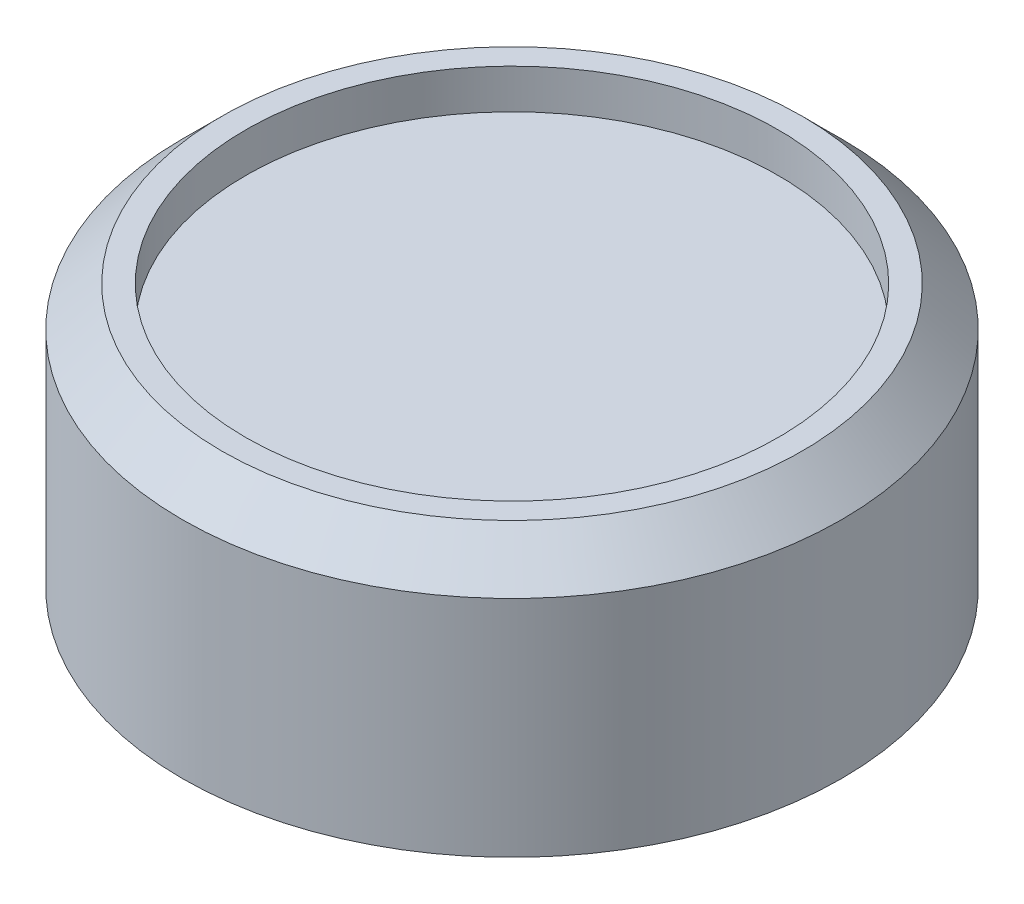
ISO-10303-21;
HEADER;
FILE_DESCRIPTION(('STEP AP214'),'2;1');
FILE_NAME('part.step','',(''),(''),'','','');
FILE_SCHEMA(('AUTOMOTIVE_DESIGN { 1 0 10303 214 1 1 1 1 }'));
ENDSEC;
DATA;
#1=APPLICATION_CONTEXT('core data for automotive mechanical design processes');
#2=APPLICATION_PROTOCOL_DEFINITION('international standard','automotive_design',2000,#1);
#3=PRODUCT_CONTEXT('',#1,'mechanical');
#4=PRODUCT('Part','Part','',(#3));
#5=PRODUCT_RELATED_PRODUCT_CATEGORY('part','',(#4));
#6=PRODUCT_DEFINITION_FORMATION('','',#4);
#7=PRODUCT_DEFINITION_CONTEXT('part definition',#1,'design');
#8=PRODUCT_DEFINITION('design','',#6,#7);
#9=PRODUCT_DEFINITION_SHAPE('','',#8);
#10=(LENGTH_UNIT() NAMED_UNIT(*) SI_UNIT(.MILLI.,.METRE.));
#11=(NAMED_UNIT(*) PLANE_ANGLE_UNIT() SI_UNIT($,.RADIAN.));
#12=(NAMED_UNIT(*) SI_UNIT($,.STERADIAN.) SOLID_ANGLE_UNIT());
#13=UNCERTAINTY_MEASURE_WITH_UNIT(LENGTH_MEASURE(1.E-05),#10,'distance_accuracy_value','');
#14=(GEOMETRIC_REPRESENTATION_CONTEXT(3) GLOBAL_UNCERTAINTY_ASSIGNED_CONTEXT((#13)) GLOBAL_UNIT_ASSIGNED_CONTEXT((#10,
#11,#12)) REPRESENTATION_CONTEXT('',''));
#15=CARTESIAN_POINT('',(0.,0.,0.));
#16=DIRECTION('',(0.,0.,1.));
#17=DIRECTION('',(1.,0.,0.));
#18=AXIS2_PLACEMENT_3D('',#15,#16,#17);
#19=CARTESIAN_POINT('',(0.,10.,0.));
#20=DIRECTION('',(0.,-1.,0.));
#21=DIRECTION('',(0.,0.,-1.));
#22=AXIS2_PLACEMENT_3D('',#19,#20,#21);
#23=CYLINDRICAL_SURFACE('',#22,12.5);
#24=CARTESIAN_POINT('',(0.,8.49999999999999,0.));
#25=DIRECTION('',(0.,1.,0.));
#26=DIRECTION('',(0.,0.,1.));
#27=AXIS2_PLACEMENT_3D('',#24,#25,#26);
#28=CIRCLE('',#27,12.5);
#29=CARTESIAN_POINT('',(0.,8.49999999999999,12.5));
#30=VERTEX_POINT('',#29);
#31=EDGE_CURVE('E43',#30,#30,#28,.F.);
#32=ORIENTED_EDGE('',*,*,#31,.T.);
#33=EDGE_LOOP('',(#32));
#34=FACE_BOUND('',#33,.T.);
#35=CARTESIAN_POINT('',(0.,0.,0.));
#36=DIRECTION('',(0.,1.,0.));
#37=DIRECTION('',(0.,0.,1.));
#38=AXIS2_PLACEMENT_3D('',#35,#36,#37);
#39=CIRCLE('',#38,12.5);
#40=CARTESIAN_POINT('',(0.,0.,12.5));
#41=VERTEX_POINT('',#40);
#42=EDGE_CURVE('E112',#41,#41,#39,.T.);
#43=ORIENTED_EDGE('',*,*,#42,.T.);
#44=EDGE_LOOP('',(#43));
#45=FACE_BOUND('',#44,.T.);
#46=ADVANCED_FACE('F34',(#34,#45),#23,.T.);
#47=CARTESIAN_POINT('',(0.,10.,0.));
#48=DIRECTION('',(0.,1.,0.));
#49=DIRECTION('',(0.,0.,1.));
#50=AXIS2_PLACEMENT_3D('',#47,#48,#49);
#51=PLANE('',#50);
#52=CARTESIAN_POINT('',(0.,10.,0.));
#53=DIRECTION('',(0.,1.,0.));
#54=DIRECTION('',(0.,0.,1.));
#55=AXIS2_PLACEMENT_3D('',#52,#53,#54);
#56=CIRCLE('',#55,10.1);
#57=CARTESIAN_POINT('',(0.,10.,10.1));
#58=VERTEX_POINT('',#57);
#59=EDGE_CURVE('E183',#58,#58,#56,.T.);
#60=ORIENTED_EDGE('',*,*,#59,.F.);
#61=EDGE_LOOP('',(#60));
#62=FACE_BOUND('',#61,.T.);
#63=CARTESIAN_POINT('',(0.,10.,0.));
#64=DIRECTION('',(0.,1.,0.));
#65=DIRECTION('',(0.,0.,1.));
#66=AXIS2_PLACEMENT_3D('',#63,#64,#65);
#67=CIRCLE('',#66,11.);
#68=CARTESIAN_POINT('',(0.,10.,11.));
#69=VERTEX_POINT('',#68);
#70=EDGE_CURVE('E115',#69,#69,#67,.T.);
#71=ORIENTED_EDGE('',*,*,#70,.T.);
#72=EDGE_LOOP('',(#71));
#73=FACE_BOUND('',#72,.T.);
#74=ADVANCED_FACE('F129',(#62,#73),#51,.T.);
#75=CARTESIAN_POINT('',(0.,0.,0.));
#76=DIRECTION('',(0.,1.,0.));
#77=DIRECTION('',(0.,0.,1.));
#78=AXIS2_PLACEMENT_3D('',#75,#76,#77);
#79=PLANE('',#78);
#80=CARTESIAN_POINT('',(0.,0.,0.));
#81=DIRECTION('',(0.,1.,0.));
#82=DIRECTION('',(0.,0.,1.));
#83=AXIS2_PLACEMENT_3D('',#80,#81,#82);
#84=CIRCLE('',#83,10.);
#85=CARTESIAN_POINT('',(0.,0.,10.));
#86=VERTEX_POINT('',#85);
#87=EDGE_CURVE('E38',#86,#86,#84,.F.);
#88=ORIENTED_EDGE('',*,*,#87,.F.);
#89=EDGE_LOOP('',(#88));
#90=FACE_BOUND('',#89,.T.);
#91=ORIENTED_EDGE('',*,*,#42,.F.);
#92=EDGE_LOOP('',(#91));
#93=FACE_BOUND('',#92,.T.);
#94=ADVANCED_FACE('F126',(#90,#93),#79,.F.);
#95=CARTESIAN_POINT('',(0.,10.,0.));
#96=DIRECTION('',(0.,-1.,0.));
#97=DIRECTION('',(0.,0.,-1.));
#98=AXIS2_PLACEMENT_3D('',#95,#96,#97);
#99=CONICAL_SURFACE('',#98,11.,0.785398163397445);
#100=ORIENTED_EDGE('',*,*,#31,.F.);
#101=EDGE_LOOP('',(#100));
#102=FACE_BOUND('',#101,.T.);
#103=ORIENTED_EDGE('',*,*,#70,.F.);
#104=EDGE_LOOP('',(#103));
#105=FACE_BOUND('',#104,.T.);
#106=ADVANCED_FACE('F36',(#102,#105),#99,.T.);
#107=CARTESIAN_POINT('',(0.,-3.7,0.));
#108=DIRECTION('',(0.,1.,0.));
#109=DIRECTION('',(0.,0.,1.));
#110=AXIS2_PLACEMENT_3D('',#107,#108,#109);
#111=CYLINDRICAL_SURFACE('',#110,10.);
#112=CARTESIAN_POINT('',(0.,2.3,0.));
#113=DIRECTION('',(0.,-1.,0.));
#114=DIRECTION('',(0.,0.,-1.));
#115=AXIS2_PLACEMENT_3D('',#112,#113,#114);
#116=CIRCLE('',#115,10.);
#117=CARTESIAN_POINT('',(0.,2.3,-10.));
#118=VERTEX_POINT('',#117);
#119=EDGE_CURVE('E182',#118,#118,#116,.T.);
#120=ORIENTED_EDGE('',*,*,#119,.F.);
#121=EDGE_LOOP('',(#120));
#122=FACE_BOUND('',#121,.T.);
#123=ORIENTED_EDGE('',*,*,#87,.T.);
#124=EDGE_LOOP('',(#123));
#125=FACE_BOUND('',#124,.T.);
#126=ADVANCED_FACE('F125',(#122,#125),#111,.F.);
#127=CARTESIAN_POINT('',(0.,2.3,0.));
#128=DIRECTION('',(0.,-1.,0.));
#129=DIRECTION('',(0.,0.,-1.));
#130=AXIS2_PLACEMENT_3D('',#127,#128,#129);
#131=PLANE('',#130);
#132=ORIENTED_EDGE('',*,*,#119,.T.);
#133=EDGE_LOOP('',(#132));
#134=FACE_BOUND('',#133,.T.);
#135=DIRECTION('',(-0.5,0.,-0.866025403784439));
#136=VECTOR('',#135,1.);
#137=CARTESIAN_POINT('',(3.8682468035705,2.3,-6.7));
#138=LINE('',#137,#136);
#139=CARTESIAN_POINT('',(7.73649360714099,2.3,0.));
#140=VERTEX_POINT('',#139);
#141=CARTESIAN_POINT('',(3.8682468035705,2.3,-6.7));
#142=VERTEX_POINT('',#141);
#143=EDGE_CURVE('E88',#140,#142,#138,.T.);
#144=ORIENTED_EDGE('',*,*,#143,.T.);
#145=DIRECTION('',(-1.,0.,0.));
#146=VECTOR('',#145,1.);
#147=CARTESIAN_POINT('',(-3.86824680357049,2.3,-6.7));
#148=LINE('',#147,#146);
#149=CARTESIAN_POINT('',(-3.86824680357049,2.3,-6.7));
#150=VERTEX_POINT('',#149);
#151=EDGE_CURVE('E96',#142,#150,#148,.T.);
#152=ORIENTED_EDGE('',*,*,#151,.T.);
#153=DIRECTION('',(-0.5,0.,0.866025403784439));
#154=VECTOR('',#153,1.);
#155=CARTESIAN_POINT('',(-7.73649360714099,2.3,0.));
#156=LINE('',#155,#154);
#157=CARTESIAN_POINT('',(-7.73649360714099,2.3,0.));
#158=VERTEX_POINT('',#157);
#159=EDGE_CURVE('E193',#150,#158,#156,.T.);
#160=ORIENTED_EDGE('',*,*,#159,.T.);
#161=DIRECTION('',(0.5,0.,0.866025403784439));
#162=VECTOR('',#161,1.);
#163=CARTESIAN_POINT('',(-3.86824680357049,2.3,6.7));
#164=LINE('',#163,#162);
#165=CARTESIAN_POINT('',(-3.86824680357049,2.3,6.7));
#166=VERTEX_POINT('',#165);
#167=EDGE_CURVE('E191',#158,#166,#164,.T.);
#168=ORIENTED_EDGE('',*,*,#167,.T.);
#169=DIRECTION('',(1.,0.,0.));
#170=VECTOR('',#169,1.);
#171=CARTESIAN_POINT('',(3.86824680357049,2.3,6.7));
#172=LINE('',#171,#170);
#173=CARTESIAN_POINT('',(3.86824680357049,2.3,6.7));
#174=VERTEX_POINT('',#173);
#175=EDGE_CURVE('E49',#166,#174,#172,.T.);
#176=ORIENTED_EDGE('',*,*,#175,.T.);
#177=DIRECTION('',(0.5,0.,-0.866025403784439));
#178=VECTOR('',#177,1.);
#179=CARTESIAN_POINT('',(7.73649360714099,2.3,0.));
#180=LINE('',#179,#178);
#181=EDGE_CURVE('E11',#174,#140,#180,.T.);
#182=ORIENTED_EDGE('',*,*,#181,.T.);
#183=EDGE_LOOP('',(#144,#152,#160,#168,#176,#182));
#184=FACE_BOUND('',#183,.T.);
#185=ADVANCED_FACE('F87',(#134,#184),#131,.T.);
#186=CARTESIAN_POINT('',(0.,8.,0.));
#187=DIRECTION('',(0.,-1.,0.));
#188=DIRECTION('',(0.,0.,-1.));
#189=AXIS2_PLACEMENT_3D('',#186,#187,#188);
#190=PLANE('',#189);
#191=DIRECTION('',(0.5,0.,0.866025403784439));
#192=VECTOR('',#191,1.);
#193=CARTESIAN_POINT('',(3.8682468035705,8.,-6.7));
#194=LINE('',#193,#192);
#195=CARTESIAN_POINT('',(3.8682468035705,8.,-6.7));
#196=VERTEX_POINT('',#195);
#197=CARTESIAN_POINT('',(7.73649360714099,8.,0.));
#198=VERTEX_POINT('',#197);
#199=EDGE_CURVE('E196',#196,#198,#194,.T.);
#200=ORIENTED_EDGE('',*,*,#199,.T.);
#201=DIRECTION('',(-0.5,0.,0.866025403784439));
#202=VECTOR('',#201,1.);
#203=CARTESIAN_POINT('',(7.73649360714099,8.,0.));
#204=LINE('',#203,#202);
#205=CARTESIAN_POINT('',(3.86824680357049,8.,6.7));
#206=VERTEX_POINT('',#205);
#207=EDGE_CURVE('E100',#198,#206,#204,.T.);
#208=ORIENTED_EDGE('',*,*,#207,.T.);
#209=DIRECTION('',(-1.,0.,0.));
#210=VECTOR('',#209,1.);
#211=CARTESIAN_POINT('',(3.86824680357049,8.,6.7));
#212=LINE('',#211,#210);
#213=CARTESIAN_POINT('',(-3.86824680357049,8.,6.7));
#214=VERTEX_POINT('',#213);
#215=EDGE_CURVE('E199',#206,#214,#212,.T.);
#216=ORIENTED_EDGE('',*,*,#215,.T.);
#217=DIRECTION('',(-0.5,0.,-0.866025403784439));
#218=VECTOR('',#217,1.);
#219=CARTESIAN_POINT('',(-3.86824680357049,8.,6.7));
#220=LINE('',#219,#218);
#221=CARTESIAN_POINT('',(-7.73649360714099,8.,0.));
#222=VERTEX_POINT('',#221);
#223=EDGE_CURVE('E202',#214,#222,#220,.T.);
#224=ORIENTED_EDGE('',*,*,#223,.T.);
#225=DIRECTION('',(0.5,0.,-0.866025403784438));
#226=VECTOR('',#225,1.);
#227=CARTESIAN_POINT('',(-7.73649360714099,8.,0.));
#228=LINE('',#227,#226);
#229=CARTESIAN_POINT('',(-3.86824680357049,8.,-6.7));
#230=VERTEX_POINT('',#229);
#231=EDGE_CURVE('E108',#222,#230,#228,.T.);
#232=ORIENTED_EDGE('',*,*,#231,.T.);
#233=DIRECTION('',(1.,0.,0.));
#234=VECTOR('',#233,1.);
#235=CARTESIAN_POINT('',(-3.86824680357049,8.,-6.7));
#236=LINE('',#235,#234);
#237=EDGE_CURVE('E103',#230,#196,#236,.T.);
#238=ORIENTED_EDGE('',*,*,#237,.T.);
#239=EDGE_LOOP('',(#200,#208,#216,#224,#232,#238));
#240=FACE_BOUND('',#239,.T.);
#241=ADVANCED_FACE('F148',(#240),#190,.T.);
#242=CARTESIAN_POINT('',(7.73649360714099,8.,0.));
#243=DIRECTION('',(0.866025403784439,0.,0.5));
#244=DIRECTION('',(0.5,0.,-0.866025403784439));
#245=AXIS2_PLACEMENT_3D('',#242,#243,#244);
#246=PLANE('',#245);
#247=ORIENTED_EDGE('',*,*,#181,.F.);
#248=DIRECTION('',(0.,-1.,0.));
#249=VECTOR('',#248,1.);
#250=CARTESIAN_POINT('',(3.86824680357049,8.,6.7));
#251=LINE('',#250,#249);
#252=EDGE_CURVE('E102',#206,#174,#251,.T.);
#253=ORIENTED_EDGE('',*,*,#252,.F.);
#254=ORIENTED_EDGE('',*,*,#207,.F.);
#255=DIRECTION('',(0.,-1.,0.));
#256=VECTOR('',#255,1.);
#257=CARTESIAN_POINT('',(7.73649360714099,8.,0.));
#258=LINE('',#257,#256);
#259=EDGE_CURVE('E94',#198,#140,#258,.T.);
#260=ORIENTED_EDGE('',*,*,#259,.T.);
#261=EDGE_LOOP('',(#247,#253,#254,#260));
#262=FACE_BOUND('',#261,.T.);
#263=ADVANCED_FACE('F98',(#262),#246,.F.);
#264=CARTESIAN_POINT('',(3.86824680357049,8.,6.7));
#265=DIRECTION('',(0.,0.,1.));
#266=DIRECTION('',(1.,0.,0.));
#267=AXIS2_PLACEMENT_3D('',#264,#265,#266);
#268=PLANE('',#267);
#269=ORIENTED_EDGE('',*,*,#175,.F.);
#270=DIRECTION('',(0.,-1.,0.));
#271=VECTOR('',#270,1.);
#272=CARTESIAN_POINT('',(-3.86824680357049,8.,6.7));
#273=LINE('',#272,#271);
#274=EDGE_CURVE('E105',#214,#166,#273,.T.);
#275=ORIENTED_EDGE('',*,*,#274,.F.);
#276=ORIENTED_EDGE('',*,*,#215,.F.);
#277=ORIENTED_EDGE('',*,*,#252,.T.);
#278=EDGE_LOOP('',(#269,#275,#276,#277));
#279=FACE_BOUND('',#278,.T.);
#280=ADVANCED_FACE('F147',(#279),#268,.F.);
#281=CARTESIAN_POINT('',(-3.86824680357049,8.,6.7));
#282=DIRECTION('',(-0.866025403784439,0.,0.5));
#283=DIRECTION('',(0.5,0.,0.866025403784439));
#284=AXIS2_PLACEMENT_3D('',#281,#282,#283);
#285=PLANE('',#284);
#286=ORIENTED_EDGE('',*,*,#167,.F.);
#287=DIRECTION('',(0.,-1.,0.));
#288=VECTOR('',#287,1.);
#289=CARTESIAN_POINT('',(-7.73649360714099,8.,0.));
#290=LINE('',#289,#288);
#291=EDGE_CURVE('E211',#222,#158,#290,.T.);
#292=ORIENTED_EDGE('',*,*,#291,.F.);
#293=ORIENTED_EDGE('',*,*,#223,.F.);
#294=ORIENTED_EDGE('',*,*,#274,.T.);
#295=EDGE_LOOP('',(#286,#292,#293,#294));
#296=FACE_BOUND('',#295,.T.);
#297=ADVANCED_FACE('F151',(#296),#285,.F.);
#298=CARTESIAN_POINT('',(-7.73649360714099,8.,0.));
#299=DIRECTION('',(-0.866025403784438,0.,-0.5));
#300=DIRECTION('',(-0.5,0.,0.866025403784439));
#301=AXIS2_PLACEMENT_3D('',#298,#299,#300);
#302=PLANE('',#301);
#303=ORIENTED_EDGE('',*,*,#159,.F.);
#304=DIRECTION('',(0.,-1.,0.));
#305=VECTOR('',#304,1.);
#306=CARTESIAN_POINT('',(-3.86824680357049,8.,-6.7));
#307=LINE('',#306,#305);
#308=EDGE_CURVE('E208',#230,#150,#307,.T.);
#309=ORIENTED_EDGE('',*,*,#308,.F.);
#310=ORIENTED_EDGE('',*,*,#231,.F.);
#311=ORIENTED_EDGE('',*,*,#291,.T.);
#312=EDGE_LOOP('',(#303,#309,#310,#311));
#313=FACE_BOUND('',#312,.T.);
#314=ADVANCED_FACE('F155',(#313),#302,.F.);
#315=CARTESIAN_POINT('',(-3.86824680357049,8.,-6.7));
#316=DIRECTION('',(0.,0.,-1.));
#317=DIRECTION('',(-1.,0.,0.));
#318=AXIS2_PLACEMENT_3D('',#315,#316,#317);
#319=PLANE('',#318);
#320=ORIENTED_EDGE('',*,*,#151,.F.);
#321=DIRECTION('',(0.,-1.,0.));
#322=VECTOR('',#321,1.);
#323=CARTESIAN_POINT('',(3.8682468035705,8.,-6.7));
#324=LINE('',#323,#322);
#325=EDGE_CURVE('E57',#196,#142,#324,.T.);
#326=ORIENTED_EDGE('',*,*,#325,.F.);
#327=ORIENTED_EDGE('',*,*,#237,.F.);
#328=ORIENTED_EDGE('',*,*,#308,.T.);
#329=EDGE_LOOP('',(#320,#326,#327,#328));
#330=FACE_BOUND('',#329,.T.);
#331=ADVANCED_FACE('F144',(#330),#319,.F.);
#332=CARTESIAN_POINT('',(3.8682468035705,8.,-6.7));
#333=DIRECTION('',(0.866025403784439,0.,-0.5));
#334=DIRECTION('',(-0.5,0.,-0.866025403784439));
#335=AXIS2_PLACEMENT_3D('',#332,#333,#334);
#336=PLANE('',#335);
#337=ORIENTED_EDGE('',*,*,#143,.F.);
#338=ORIENTED_EDGE('',*,*,#259,.F.);
#339=ORIENTED_EDGE('',*,*,#199,.F.);
#340=ORIENTED_EDGE('',*,*,#325,.T.);
#341=EDGE_LOOP('',(#337,#338,#339,#340));
#342=FACE_BOUND('',#341,.T.);
#343=ADVANCED_FACE('F93',(#342),#336,.F.);
#344=CARTESIAN_POINT('',(0.,8.5,0.));
#345=DIRECTION('',(0.,1.,0.));
#346=DIRECTION('',(0.,0.,1.));
#347=AXIS2_PLACEMENT_3D('',#344,#345,#346);
#348=CYLINDRICAL_SURFACE('',#347,10.1);
#349=CARTESIAN_POINT('',(0.,8.5,0.));
#350=DIRECTION('',(0.,1.,0.));
#351=DIRECTION('',(0.,0.,1.));
#352=AXIS2_PLACEMENT_3D('',#349,#350,#351);
#353=CIRCLE('',#352,10.1);
#354=CARTESIAN_POINT('',(0.,8.5,10.1));
#355=VERTEX_POINT('',#354);
#356=EDGE_CURVE('E181',#355,#355,#353,.T.);
#357=ORIENTED_EDGE('',*,*,#356,.F.);
#358=EDGE_LOOP('',(#357));
#359=FACE_BOUND('',#358,.T.);
#360=ORIENTED_EDGE('',*,*,#59,.T.);
#361=EDGE_LOOP('',(#360));
#362=FACE_BOUND('',#361,.T.);
#363=ADVANCED_FACE('F143',(#359,#362),#348,.F.);
#364=CARTESIAN_POINT('',(0.,8.5,0.));
#365=DIRECTION('',(0.,1.,0.));
#366=DIRECTION('',(0.,0.,1.));
#367=AXIS2_PLACEMENT_3D('',#364,#365,#366);
#368=PLANE('',#367);
#369=ORIENTED_EDGE('',*,*,#356,.T.);
#370=EDGE_LOOP('',(#369));
#371=FACE_BOUND('',#370,.T.);
#372=ADVANCED_FACE('F173',(#371),#368,.T.);
#373=CLOSED_SHELL('',(#46,#74,#94,#106,#126,#185,#241,#263,#280,#297,#314,#331,#343,#363,#372));
#374=MANIFOLD_SOLID_BREP('B2',#373);
#375=ADVANCED_BREP_SHAPE_REPRESENTATION('',(#18,#374),#14);
#376=SHAPE_DEFINITION_REPRESENTATION(#9,#375);
ENDSEC;
END-ISO-10303-21;
